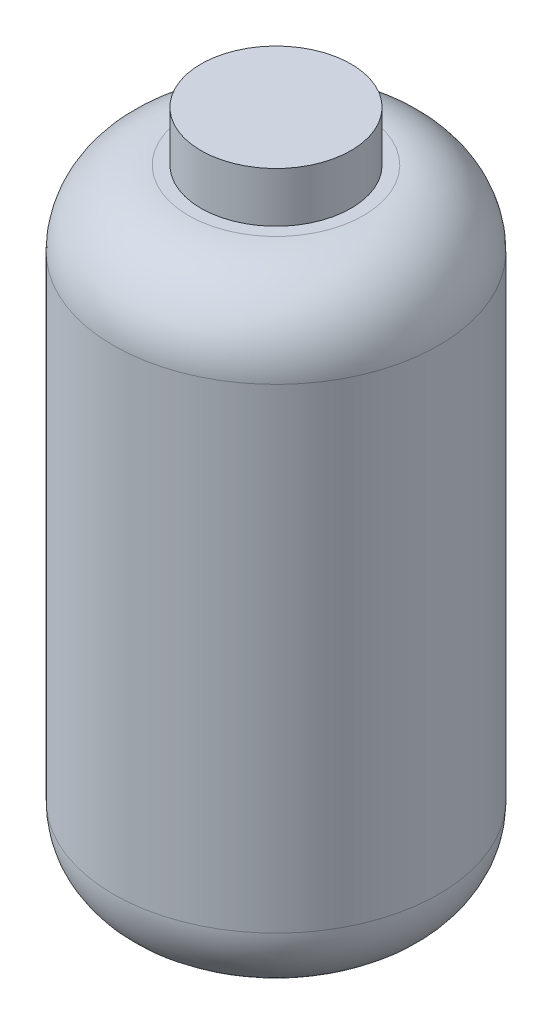
ISO-10303-21;
HEADER;
FILE_DESCRIPTION(('STEP AP214'),'2;1');
FILE_NAME('part.step','',(''),(''),'','','');
FILE_SCHEMA(('AUTOMOTIVE_DESIGN { 1 0 10303 214 1 1 1 1 }'));
ENDSEC;
DATA;
#1=APPLICATION_CONTEXT('core data for automotive mechanical design processes');
#2=APPLICATION_PROTOCOL_DEFINITION('international standard','automotive_design',2000,#1);
#3=PRODUCT_CONTEXT('',#1,'mechanical');
#4=PRODUCT('Part','Part','',(#3));
#5=PRODUCT_RELATED_PRODUCT_CATEGORY('part','',(#4));
#6=PRODUCT_DEFINITION_FORMATION('','',#4);
#7=PRODUCT_DEFINITION_CONTEXT('part definition',#1,'design');
#8=PRODUCT_DEFINITION('design','',#6,#7);
#9=PRODUCT_DEFINITION_SHAPE('','',#8);
#10=(LENGTH_UNIT() NAMED_UNIT(*) SI_UNIT(.MILLI.,.METRE.));
#11=(NAMED_UNIT(*) PLANE_ANGLE_UNIT() SI_UNIT($,.RADIAN.));
#12=(NAMED_UNIT(*) SI_UNIT($,.STERADIAN.) SOLID_ANGLE_UNIT());
#13=UNCERTAINTY_MEASURE_WITH_UNIT(LENGTH_MEASURE(1.E-05),#10,'distance_accuracy_value','');
#14=(GEOMETRIC_REPRESENTATION_CONTEXT(3) GLOBAL_UNCERTAINTY_ASSIGNED_CONTEXT((#13)) GLOBAL_UNIT_ASSIGNED_CONTEXT((#10,
#11,#12)) REPRESENTATION_CONTEXT('',''));
#15=CARTESIAN_POINT('',(0.,0.,0.));
#16=DIRECTION('',(0.,0.,1.));
#17=DIRECTION('',(1.,0.,0.));
#18=AXIS2_PLACEMENT_3D('',#15,#16,#17);
#19=CARTESIAN_POINT('',(0.,135.,0.));
#20=DIRECTION('',(0.,-1.,0.));
#21=DIRECTION('',(0.,0.,-1.));
#22=AXIS2_PLACEMENT_3D('',#19,#20,#21);
#23=CYLINDRICAL_SURFACE('',#22,15.);
#24=CARTESIAN_POINT('',(0.,135.,0.));
#25=DIRECTION('',(0.,1.,0.));
#26=DIRECTION('',(0.,0.,1.));
#27=AXIS2_PLACEMENT_3D('',#24,#25,#26);
#28=CIRCLE('',#27,15.);
#29=CARTESIAN_POINT('',(0.,135.,15.));
#30=VERTEX_POINT('',#29);
#31=EDGE_CURVE('E11',#30,#30,#28,.T.);
#32=ORIENTED_EDGE('',*,*,#31,.F.);
#33=EDGE_LOOP('',(#32));
#34=FACE_BOUND('',#33,.T.);
#35=CARTESIAN_POINT('',(0.,125.,0.));
#36=DIRECTION('',(0.,1.,0.));
#37=DIRECTION('',(0.,0.,1.));
#38=AXIS2_PLACEMENT_3D('',#35,#36,#37);
#39=CIRCLE('',#38,15.);
#40=CARTESIAN_POINT('',(0.,125.,15.));
#41=VERTEX_POINT('',#40);
#42=EDGE_CURVE('E50',#41,#41,#39,.T.);
#43=ORIENTED_EDGE('',*,*,#42,.T.);
#44=EDGE_LOOP('',(#43));
#45=FACE_BOUND('',#44,.T.);
#46=ADVANCED_FACE('F47',(#34,#45),#23,.T.);
#47=CARTESIAN_POINT('',(0.,135.,0.));
#48=DIRECTION('',(0.,1.,0.));
#49=DIRECTION('',(0.,0.,1.));
#50=AXIS2_PLACEMENT_3D('',#47,#48,#49);
#51=PLANE('',#50);
#52=ORIENTED_EDGE('',*,*,#31,.T.);
#53=EDGE_LOOP('',(#52));
#54=FACE_BOUND('',#53,.T.);
#55=ADVANCED_FACE('F62',(#54),#51,.T.);
#56=CARTESIAN_POINT('',(0.,125.,0.));
#57=DIRECTION('',(0.,1.,0.));
#58=DIRECTION('',(0.,0.,1.));
#59=AXIS2_PLACEMENT_3D('',#56,#57,#58);
#60=PLANE('',#59);
#61=ORIENTED_EDGE('',*,*,#42,.F.);
#62=EDGE_LOOP('',(#61));
#63=FACE_BOUND('',#62,.T.);
#64=ADVANCED_FACE('F60',(#63),#60,.F.);
#65=CLOSED_SHELL('',(#46,#55,#64));
#66=MANIFOLD_SOLID_BREP('B2',#65);
#67=CARTESIAN_POINT('',(0.,125.,0.));
#68=DIRECTION('',(0.,-1.,0.));
#69=DIRECTION('',(0.,0.,-1.));
#70=AXIS2_PLACEMENT_3D('',#67,#68,#69);
#71=CYLINDRICAL_SURFACE('',#70,32.5);
#72=CARTESIAN_POINT('',(0.,15.,0.));
#73=DIRECTION('',(0.,1.,0.));
#74=DIRECTION('',(0.,0.,1.));
#75=AXIS2_PLACEMENT_3D('',#72,#73,#74);
#76=CIRCLE('',#75,32.5);
#77=CARTESIAN_POINT('',(0.,15.,32.5));
#78=VERTEX_POINT('',#77);
#79=EDGE_CURVE('E101',#78,#78,#76,.T.);
#80=ORIENTED_EDGE('',*,*,#79,.T.);
#81=EDGE_LOOP('',(#80));
#82=FACE_BOUND('',#81,.T.);
#83=CARTESIAN_POINT('',(0.,110.,0.));
#84=DIRECTION('',(0.,1.,0.));
#85=DIRECTION('',(0.,0.,1.));
#86=AXIS2_PLACEMENT_3D('',#83,#84,#85);
#87=CIRCLE('',#86,32.5);
#88=CARTESIAN_POINT('',(0.,110.,32.5));
#89=VERTEX_POINT('',#88);
#90=EDGE_CURVE('E106',#89,#89,#87,.F.);
#91=ORIENTED_EDGE('',*,*,#90,.T.);
#92=EDGE_LOOP('',(#91));
#93=FACE_BOUND('',#92,.T.);
#94=ADVANCED_FACE('F88',(#82,#93),#71,.T.);
#95=CARTESIAN_POINT('',(0.,125.,0.));
#96=DIRECTION('',(0.,1.,0.));
#97=DIRECTION('',(0.,0.,1.));
#98=AXIS2_PLACEMENT_3D('',#95,#96,#97);
#99=PLANE('',#98);
#100=CARTESIAN_POINT('',(0.,125.,0.));
#101=DIRECTION('',(0.,1.,0.));
#102=DIRECTION('',(0.,0.,1.));
#103=AXIS2_PLACEMENT_3D('',#100,#101,#102);
#104=CIRCLE('',#103,17.5);
#105=CARTESIAN_POINT('',(0.,125.,17.5));
#106=VERTEX_POINT('',#105);
#107=EDGE_CURVE('E46',#106,#106,#104,.T.);
#108=ORIENTED_EDGE('',*,*,#107,.T.);
#109=EDGE_LOOP('',(#108));
#110=FACE_BOUND('',#109,.T.);
#111=ADVANCED_FACE('F123',(#110),#99,.T.);
#112=CARTESIAN_POINT('',(0.,0.,0.));
#113=DIRECTION('',(0.,1.,0.));
#114=DIRECTION('',(0.,0.,1.));
#115=AXIS2_PLACEMENT_3D('',#112,#113,#114);
#116=PLANE('',#115);
#117=CARTESIAN_POINT('',(0.,0.,0.));
#118=DIRECTION('',(0.,1.,0.));
#119=DIRECTION('',(0.,0.,1.));
#120=AXIS2_PLACEMENT_3D('',#117,#118,#119);
#121=CIRCLE('',#120,17.5);
#122=CARTESIAN_POINT('',(0.,0.,17.5));
#123=VERTEX_POINT('',#122);
#124=EDGE_CURVE('E96',#123,#123,#121,.F.);
#125=ORIENTED_EDGE('',*,*,#124,.T.);
#126=EDGE_LOOP('',(#125));
#127=FACE_BOUND('',#126,.T.);
#128=ADVANCED_FACE('F120',(#127),#116,.F.);
#129=CARTESIAN_POINT('',(0.,15.,0.));
#130=DIRECTION('',(0.,1.,0.));
#131=DIRECTION('',(0.,0.,1.));
#132=AXIS2_PLACEMENT_3D('',#129,#130,#131);
#133=TOROIDAL_SURFACE('',#132,17.5,15.);
#134=ORIENTED_EDGE('',*,*,#124,.F.);
#135=EDGE_LOOP('',(#134));
#136=FACE_BOUND('',#135,.T.);
#137=ORIENTED_EDGE('',*,*,#79,.F.);
#138=EDGE_LOOP('',(#137));
#139=FACE_BOUND('',#138,.T.);
#140=ADVANCED_FACE('F116',(#136,#139),#133,.T.);
#141=CARTESIAN_POINT('',(0.,110.,0.));
#142=DIRECTION('',(0.,1.,0.));
#143=DIRECTION('',(0.,0.,1.));
#144=AXIS2_PLACEMENT_3D('',#141,#142,#143);
#145=TOROIDAL_SURFACE('',#144,17.5,15.);
#146=ORIENTED_EDGE('',*,*,#90,.F.);
#147=EDGE_LOOP('',(#146));
#148=FACE_BOUND('',#147,.T.);
#149=ORIENTED_EDGE('',*,*,#107,.F.);
#150=EDGE_LOOP('',(#149));
#151=FACE_BOUND('',#150,.T.);
#152=ADVANCED_FACE('F90',(#148,#151),#145,.T.);
#153=CLOSED_SHELL('',(#94,#111,#128,#140,#152));
#154=MANIFOLD_SOLID_BREP('B6',#153);
#155=ADVANCED_BREP_SHAPE_REPRESENTATION('',(#18,#66,#154),#14);
#156=SHAPE_DEFINITION_REPRESENTATION(#9,#155);
ENDSEC;
END-ISO-10303-21;
